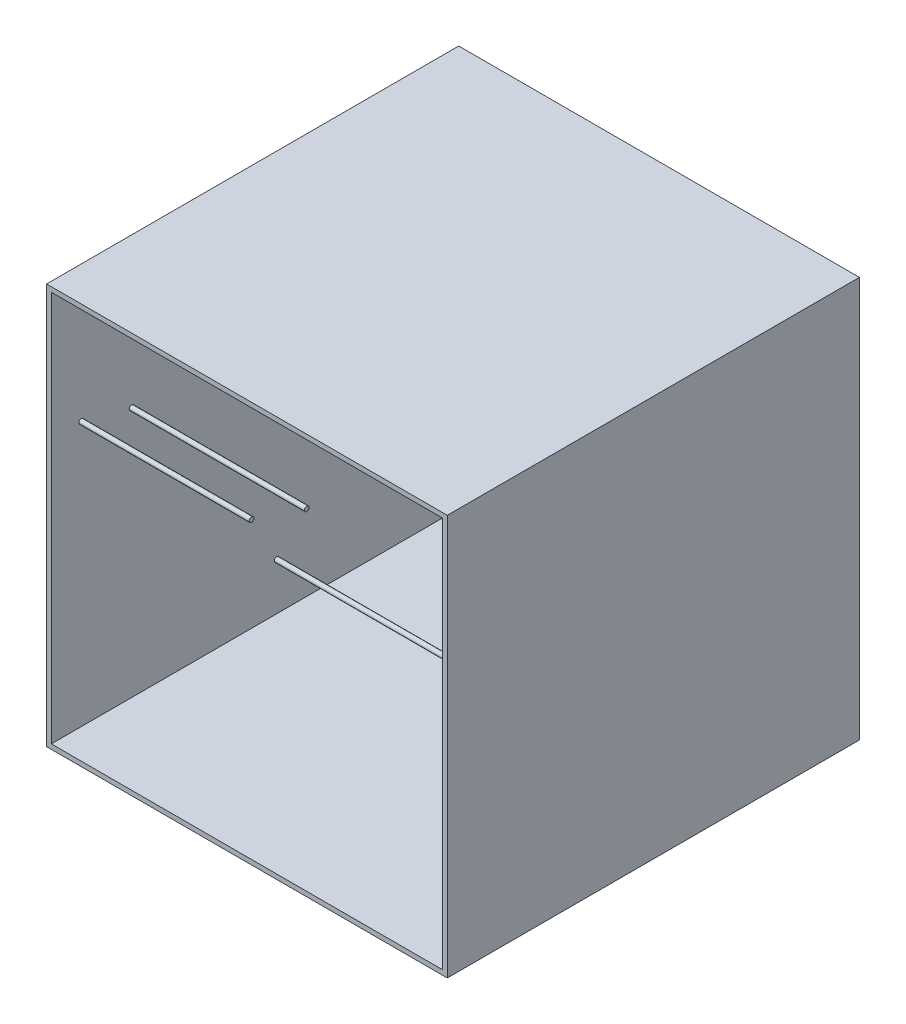
ISO-10303-21;
HEADER;
FILE_DESCRIPTION(('STEP AP214'),'2;1');
FILE_NAME('part.step','',(''),(''),'','','');
FILE_SCHEMA(('AUTOMOTIVE_DESIGN { 1 0 10303 214 1 1 1 1 }'));
ENDSEC;
DATA;
#1=APPLICATION_CONTEXT('core data for automotive mechanical design processes');
#2=APPLICATION_PROTOCOL_DEFINITION('international standard','automotive_design',2000,#1);
#3=PRODUCT_CONTEXT('',#1,'mechanical');
#4=PRODUCT('Part','Part','',(#3));
#5=PRODUCT_RELATED_PRODUCT_CATEGORY('part','',(#4));
#6=PRODUCT_DEFINITION_FORMATION('','',#4);
#7=PRODUCT_DEFINITION_CONTEXT('part definition',#1,'design');
#8=PRODUCT_DEFINITION('design','',#6,#7);
#9=PRODUCT_DEFINITION_SHAPE('','',#8);
#10=(LENGTH_UNIT() NAMED_UNIT(*) SI_UNIT(.MILLI.,.METRE.));
#11=(NAMED_UNIT(*) PLANE_ANGLE_UNIT() SI_UNIT($,.RADIAN.));
#12=(NAMED_UNIT(*) SI_UNIT($,.STERADIAN.) SOLID_ANGLE_UNIT());
#13=UNCERTAINTY_MEASURE_WITH_UNIT(LENGTH_MEASURE(1.E-05),#10,'distance_accuracy_value','');
#14=(GEOMETRIC_REPRESENTATION_CONTEXT(3) GLOBAL_UNCERTAINTY_ASSIGNED_CONTEXT((#13)) GLOBAL_UNIT_ASSIGNED_CONTEXT((#10,
#11,#12)) REPRESENTATION_CONTEXT('',''));
#15=CARTESIAN_POINT('',(0.,0.,0.));
#16=DIRECTION('',(0.,0.,1.));
#17=DIRECTION('',(1.,0.,0.));
#18=AXIS2_PLACEMENT_3D('',#15,#16,#17);
#19=CARTESIAN_POINT('',(0.,0.,432.));
#20=DIRECTION('',(0.,0.,1.));
#21=DIRECTION('',(1.,0.,0.));
#22=AXIS2_PLACEMENT_3D('',#19,#20,#21);
#23=PLANE('',#22);
#24=DIRECTION('',(0.,-1.,0.));
#25=VECTOR('',#24,1.);
#26=CARTESIAN_POINT('',(-210.,210.,432.));
#27=LINE('',#26,#25);
#28=CARTESIAN_POINT('',(-210.,210.,432.));
#29=VERTEX_POINT('',#28);
#30=CARTESIAN_POINT('',(-210.,-210.,432.));
#31=VERTEX_POINT('',#30);
#32=EDGE_CURVE('E161',#29,#31,#27,.T.);
#33=ORIENTED_EDGE('',*,*,#32,.T.);
#34=DIRECTION('',(1.,0.,0.));
#35=VECTOR('',#34,1.);
#36=CARTESIAN_POINT('',(-210.,-210.,432.));
#37=LINE('',#36,#35);
#38=CARTESIAN_POINT('',(210.,-210.,432.));
#39=VERTEX_POINT('',#38);
#40=EDGE_CURVE('E165',#31,#39,#37,.T.);
#41=ORIENTED_EDGE('',*,*,#40,.T.);
#42=DIRECTION('',(0.,1.,0.));
#43=VECTOR('',#42,1.);
#44=CARTESIAN_POINT('',(210.,210.,432.));
#45=LINE('',#44,#43);
#46=CARTESIAN_POINT('',(210.,210.,432.));
#47=VERTEX_POINT('',#46);
#48=EDGE_CURVE('E169',#39,#47,#45,.T.);
#49=ORIENTED_EDGE('',*,*,#48,.T.);
#50=DIRECTION('',(-1.,0.,0.));
#51=VECTOR('',#50,1.);
#52=CARTESIAN_POINT('',(-210.,210.,432.));
#53=LINE('',#52,#51);
#54=EDGE_CURVE('E172',#47,#29,#53,.T.);
#55=ORIENTED_EDGE('',*,*,#54,.T.);
#56=EDGE_LOOP('',(#33,#41,#49,#55));
#57=FACE_BOUND('',#56,.T.);
#58=DIRECTION('',(1.,0.,0.));
#59=VECTOR('',#58,1.);
#60=CARTESIAN_POINT('',(205.,-205.,432.));
#61=LINE('',#60,#59);
#62=CARTESIAN_POINT('',(-205.,-205.,432.));
#63=VERTEX_POINT('',#62);
#64=CARTESIAN_POINT('',(205.,-205.,432.));
#65=VERTEX_POINT('',#64);
#66=EDGE_CURVE('E120',#63,#65,#61,.T.);
#67=ORIENTED_EDGE('',*,*,#66,.F.);
#68=DIRECTION('',(0.,-1.,0.));
#69=VECTOR('',#68,1.);
#70=CARTESIAN_POINT('',(-205.,-205.,432.));
#71=LINE('',#70,#69);
#72=CARTESIAN_POINT('',(-205.,205.,432.));
#73=VERTEX_POINT('',#72);
#74=EDGE_CURVE('E111',#73,#63,#71,.T.);
#75=ORIENTED_EDGE('',*,*,#74,.F.);
#76=DIRECTION('',(-1.,0.,0.));
#77=VECTOR('',#76,1.);
#78=CARTESIAN_POINT('',(205.,205.,432.));
#79=LINE('',#78,#77);
#80=CARTESIAN_POINT('',(205.,205.,432.));
#81=VERTEX_POINT('',#80);
#82=EDGE_CURVE('E137',#81,#73,#79,.T.);
#83=ORIENTED_EDGE('',*,*,#82,.F.);
#84=DIRECTION('',(0.,1.,0.));
#85=VECTOR('',#84,1.);
#86=CARTESIAN_POINT('',(205.,-205.,432.));
#87=LINE('',#86,#85);
#88=EDGE_CURVE('E133',#65,#81,#87,.T.);
#89=ORIENTED_EDGE('',*,*,#88,.F.);
#90=EDGE_LOOP('',(#67,#75,#83,#89));
#91=FACE_BOUND('',#90,.T.);
#92=ADVANCED_FACE('F45',(#57,#91),#23,.T.);
#93=CARTESIAN_POINT('',(0.,0.,0.));
#94=DIRECTION('',(0.,0.,1.));
#95=DIRECTION('',(1.,0.,0.));
#96=AXIS2_PLACEMENT_3D('',#93,#94,#95);
#97=PLANE('',#96);
#98=DIRECTION('',(0.,-1.,0.));
#99=VECTOR('',#98,1.);
#100=CARTESIAN_POINT('',(-210.,210.,0.));
#101=LINE('',#100,#99);
#102=CARTESIAN_POINT('',(-210.,210.,0.));
#103=VERTEX_POINT('',#102);
#104=CARTESIAN_POINT('',(-210.,-210.,0.));
#105=VERTEX_POINT('',#104);
#106=EDGE_CURVE('E129',#103,#105,#101,.T.);
#107=ORIENTED_EDGE('',*,*,#106,.F.);
#108=DIRECTION('',(-1.,0.,0.));
#109=VECTOR('',#108,1.);
#110=CARTESIAN_POINT('',(-210.,210.,0.));
#111=LINE('',#110,#109);
#112=CARTESIAN_POINT('',(210.,210.,0.));
#113=VERTEX_POINT('',#112);
#114=EDGE_CURVE('E166',#113,#103,#111,.T.);
#115=ORIENTED_EDGE('',*,*,#114,.F.);
#116=DIRECTION('',(0.,1.,0.));
#117=VECTOR('',#116,1.);
#118=CARTESIAN_POINT('',(210.,210.,0.));
#119=LINE('',#118,#117);
#120=CARTESIAN_POINT('',(210.,-210.,0.));
#121=VERTEX_POINT('',#120);
#122=EDGE_CURVE('E182',#121,#113,#119,.T.);
#123=ORIENTED_EDGE('',*,*,#122,.F.);
#124=DIRECTION('',(1.,0.,0.));
#125=VECTOR('',#124,1.);
#126=CARTESIAN_POINT('',(-210.,-210.,0.));
#127=LINE('',#126,#125);
#128=EDGE_CURVE('E179',#105,#121,#127,.T.);
#129=ORIENTED_EDGE('',*,*,#128,.F.);
#130=EDGE_LOOP('',(#107,#115,#123,#129));
#131=FACE_BOUND('',#130,.T.);
#132=DIRECTION('',(0.,-1.,0.));
#133=VECTOR('',#132,1.);
#134=CARTESIAN_POINT('',(-205.,-205.,0.));
#135=LINE('',#134,#133);
#136=CARTESIAN_POINT('',(-205.,205.,0.));
#137=VERTEX_POINT('',#136);
#138=CARTESIAN_POINT('',(-205.,-205.,0.));
#139=VERTEX_POINT('',#138);
#140=EDGE_CURVE('E69',#137,#139,#135,.T.);
#141=ORIENTED_EDGE('',*,*,#140,.T.);
#142=DIRECTION('',(1.,0.,0.));
#143=VECTOR('',#142,1.);
#144=CARTESIAN_POINT('',(205.,-205.,0.));
#145=LINE('',#144,#143);
#146=CARTESIAN_POINT('',(205.,-205.,0.));
#147=VERTEX_POINT('',#146);
#148=EDGE_CURVE('E127',#139,#147,#145,.T.);
#149=ORIENTED_EDGE('',*,*,#148,.T.);
#150=DIRECTION('',(0.,1.,0.));
#151=VECTOR('',#150,1.);
#152=CARTESIAN_POINT('',(205.,-205.,0.));
#153=LINE('',#152,#151);
#154=CARTESIAN_POINT('',(205.,205.,0.));
#155=VERTEX_POINT('',#154);
#156=EDGE_CURVE('E148',#147,#155,#153,.T.);
#157=ORIENTED_EDGE('',*,*,#156,.T.);
#158=DIRECTION('',(-1.,0.,0.));
#159=VECTOR('',#158,1.);
#160=CARTESIAN_POINT('',(205.,205.,0.));
#161=LINE('',#160,#159);
#162=EDGE_CURVE('E121',#155,#137,#161,.T.);
#163=ORIENTED_EDGE('',*,*,#162,.T.);
#164=EDGE_LOOP('',(#141,#149,#157,#163));
#165=FACE_BOUND('',#164,.T.);
#166=ADVANCED_FACE('F229',(#131,#165),#97,.F.);
#167=CARTESIAN_POINT('',(-210.,210.,432.));
#168=DIRECTION('',(1.,0.,0.));
#169=DIRECTION('',(0.,0.,-1.));
#170=AXIS2_PLACEMENT_3D('',#167,#168,#169);
#171=PLANE('',#170);
#172=ORIENTED_EDGE('',*,*,#106,.T.);
#173=DIRECTION('',(0.,0.,-1.));
#174=VECTOR('',#173,1.);
#175=CARTESIAN_POINT('',(-210.,-210.,432.));
#176=LINE('',#175,#174);
#177=EDGE_CURVE('E198',#31,#105,#176,.T.);
#178=ORIENTED_EDGE('',*,*,#177,.F.);
#179=ORIENTED_EDGE('',*,*,#32,.F.);
#180=DIRECTION('',(0.,0.,-1.));
#181=VECTOR('',#180,1.);
#182=CARTESIAN_POINT('',(-210.,210.,432.));
#183=LINE('',#182,#181);
#184=EDGE_CURVE('E175',#29,#103,#183,.T.);
#185=ORIENTED_EDGE('',*,*,#184,.T.);
#186=EDGE_LOOP('',(#172,#178,#179,#185));
#187=FACE_BOUND('',#186,.T.);
#188=ADVANCED_FACE('F47',(#187),#171,.F.);
#189=CARTESIAN_POINT('',(-210.,-210.,432.));
#190=DIRECTION('',(0.,1.,0.));
#191=DIRECTION('',(-1.,0.,0.));
#192=AXIS2_PLACEMENT_3D('',#189,#190,#191);
#193=PLANE('',#192);
#194=ORIENTED_EDGE('',*,*,#128,.T.);
#195=DIRECTION('',(0.,0.,-1.));
#196=VECTOR('',#195,1.);
#197=CARTESIAN_POINT('',(210.,-210.,432.));
#198=LINE('',#197,#196);
#199=EDGE_CURVE('E194',#39,#121,#198,.T.);
#200=ORIENTED_EDGE('',*,*,#199,.F.);
#201=ORIENTED_EDGE('',*,*,#40,.F.);
#202=ORIENTED_EDGE('',*,*,#177,.T.);
#203=EDGE_LOOP('',(#194,#200,#201,#202));
#204=FACE_BOUND('',#203,.T.);
#205=ADVANCED_FACE('F256',(#204),#193,.F.);
#206=CARTESIAN_POINT('',(210.,210.,432.));
#207=DIRECTION('',(-1.,0.,0.));
#208=DIRECTION('',(0.,0.,1.));
#209=AXIS2_PLACEMENT_3D('',#206,#207,#208);
#210=PLANE('',#209);
#211=ORIENTED_EDGE('',*,*,#122,.T.);
#212=DIRECTION('',(0.,0.,-1.));
#213=VECTOR('',#212,1.);
#214=CARTESIAN_POINT('',(210.,210.,432.));
#215=LINE('',#214,#213);
#216=EDGE_CURVE('E190',#47,#113,#215,.T.);
#217=ORIENTED_EDGE('',*,*,#216,.F.);
#218=ORIENTED_EDGE('',*,*,#48,.F.);
#219=ORIENTED_EDGE('',*,*,#199,.T.);
#220=EDGE_LOOP('',(#211,#217,#218,#219));
#221=FACE_BOUND('',#220,.T.);
#222=ADVANCED_FACE('F253',(#221),#210,.F.);
#223=CARTESIAN_POINT('',(-210.,210.,432.));
#224=DIRECTION('',(0.,-1.,0.));
#225=DIRECTION('',(1.,0.,0.));
#226=AXIS2_PLACEMENT_3D('',#223,#224,#225);
#227=PLANE('',#226);
#228=ORIENTED_EDGE('',*,*,#114,.T.);
#229=ORIENTED_EDGE('',*,*,#184,.F.);
#230=ORIENTED_EDGE('',*,*,#54,.F.);
#231=ORIENTED_EDGE('',*,*,#216,.T.);
#232=EDGE_LOOP('',(#228,#229,#230,#231));
#233=FACE_BOUND('',#232,.T.);
#234=ADVANCED_FACE('F250',(#233),#227,.F.);
#235=CARTESIAN_POINT('',(-205.,-205.,432.));
#236=DIRECTION('',(1.,0.,0.));
#237=DIRECTION('',(0.,0.,-1.));
#238=AXIS2_PLACEMENT_3D('',#235,#236,#237);
#239=PLANE('',#238);
#240=CARTESIAN_POINT('',(-205.,-10.05,150.03));
#241=DIRECTION('',(1.,0.,0.));
#242=DIRECTION('',(0.,0.,-1.));
#243=AXIS2_PLACEMENT_3D('',#240,#241,#242);
#244=CIRCLE('',#243,15.);
#245=CARTESIAN_POINT('',(-205.,-10.05,135.03));
#246=VERTEX_POINT('',#245);
#247=EDGE_CURVE('E11',#246,#246,#244,.T.);
#248=ORIENTED_EDGE('',*,*,#247,.F.);
#249=EDGE_LOOP('',(#248));
#250=FACE_BOUND('',#249,.T.);
#251=CARTESIAN_POINT('',(-205.,58.16,347.87));
#252=DIRECTION('',(1.,0.,0.));
#253=DIRECTION('',(0.,0.,-1.));
#254=AXIS2_PLACEMENT_3D('',#251,#252,#253);
#255=CIRCLE('',#254,2.50000000000002);
#256=CARTESIAN_POINT('',(-205.,58.16,345.37));
#257=VERTEX_POINT('',#256);
#258=EDGE_CURVE('E206',#257,#257,#255,.T.);
#259=ORIENTED_EDGE('',*,*,#258,.F.);
#260=EDGE_LOOP('',(#259));
#261=FACE_BOUND('',#260,.T.);
#262=CARTESIAN_POINT('',(-205.,72.17,400.68));
#263=DIRECTION('',(1.,0.,0.));
#264=DIRECTION('',(0.,0.,-1.));
#265=AXIS2_PLACEMENT_3D('',#262,#263,#264);
#266=CIRCLE('',#265,2.50000000000002);
#267=CARTESIAN_POINT('',(-205.,72.17,398.18));
#268=VERTEX_POINT('',#267);
#269=EDGE_CURVE('E202',#268,#268,#266,.T.);
#270=ORIENTED_EDGE('',*,*,#269,.F.);
#271=EDGE_LOOP('',(#270));
#272=FACE_BOUND('',#271,.T.);
#273=ORIENTED_EDGE('',*,*,#140,.F.);
#274=DIRECTION('',(0.,0.,-1.));
#275=VECTOR('',#274,1.);
#276=CARTESIAN_POINT('',(-205.,205.,432.));
#277=LINE('',#276,#275);
#278=EDGE_CURVE('E115',#73,#137,#277,.T.);
#279=ORIENTED_EDGE('',*,*,#278,.F.);
#280=ORIENTED_EDGE('',*,*,#74,.T.);
#281=DIRECTION('',(0.,0.,-1.));
#282=VECTOR('',#281,1.);
#283=CARTESIAN_POINT('',(-205.,-205.,432.));
#284=LINE('',#283,#282);
#285=EDGE_CURVE('E114',#63,#139,#284,.T.);
#286=ORIENTED_EDGE('',*,*,#285,.T.);
#287=EDGE_LOOP('',(#273,#279,#280,#286));
#288=FACE_BOUND('',#287,.T.);
#289=ADVANCED_FACE('F113',(#250,#261,#272,#288),#239,.T.);
#290=CARTESIAN_POINT('',(205.,-205.,432.));
#291=DIRECTION('',(0.,1.,0.));
#292=DIRECTION('',(-1.,0.,0.));
#293=AXIS2_PLACEMENT_3D('',#290,#291,#292);
#294=PLANE('',#293);
#295=ORIENTED_EDGE('',*,*,#148,.F.);
#296=ORIENTED_EDGE('',*,*,#285,.F.);
#297=ORIENTED_EDGE('',*,*,#66,.T.);
#298=DIRECTION('',(0.,0.,-1.));
#299=VECTOR('',#298,1.);
#300=CARTESIAN_POINT('',(205.,-205.,432.));
#301=LINE('',#300,#299);
#302=EDGE_CURVE('E130',#65,#147,#301,.T.);
#303=ORIENTED_EDGE('',*,*,#302,.T.);
#304=EDGE_LOOP('',(#295,#296,#297,#303));
#305=FACE_BOUND('',#304,.T.);
#306=ADVANCED_FACE('F124',(#305),#294,.T.);
#307=CARTESIAN_POINT('',(205.,-205.,432.));
#308=DIRECTION('',(-1.,0.,0.));
#309=DIRECTION('',(0.,0.,1.));
#310=AXIS2_PLACEMENT_3D('',#307,#308,#309);
#311=PLANE('',#310);
#312=CARTESIAN_POINT('',(205.,75.92,427.35));
#313=DIRECTION('',(-1.,0.,0.));
#314=DIRECTION('',(0.,0.,1.));
#315=AXIS2_PLACEMENT_3D('',#312,#313,#314);
#316=CIRCLE('',#315,2.50000000000002);
#317=CARTESIAN_POINT('',(205.,75.92,429.85));
#318=VERTEX_POINT('',#317);
#319=EDGE_CURVE('E54',#318,#318,#316,.T.);
#320=ORIENTED_EDGE('',*,*,#319,.F.);
#321=EDGE_LOOP('',(#320));
#322=FACE_BOUND('',#321,.T.);
#323=CARTESIAN_POINT('',(205.,138.09,353.49));
#324=DIRECTION('',(-1.,0.,0.));
#325=DIRECTION('',(0.,0.,1.));
#326=AXIS2_PLACEMENT_3D('',#323,#324,#325);
#327=CIRCLE('',#326,2.50000000000002);
#328=CARTESIAN_POINT('',(205.,138.09,355.99));
#329=VERTEX_POINT('',#328);
#330=EDGE_CURVE('E210',#329,#329,#327,.T.);
#331=ORIENTED_EDGE('',*,*,#330,.F.);
#332=EDGE_LOOP('',(#331));
#333=FACE_BOUND('',#332,.T.);
#334=ORIENTED_EDGE('',*,*,#156,.F.);
#335=ORIENTED_EDGE('',*,*,#302,.F.);
#336=ORIENTED_EDGE('',*,*,#88,.T.);
#337=DIRECTION('',(0.,0.,-1.));
#338=VECTOR('',#337,1.);
#339=CARTESIAN_POINT('',(205.,205.,432.));
#340=LINE('',#339,#338);
#341=EDGE_CURVE('E61',#81,#155,#340,.T.);
#342=ORIENTED_EDGE('',*,*,#341,.T.);
#343=EDGE_LOOP('',(#334,#335,#336,#342));
#344=FACE_BOUND('',#343,.T.);
#345=ADVANCED_FACE('F220',(#322,#333,#344),#311,.T.);
#346=CARTESIAN_POINT('',(205.,205.,432.));
#347=DIRECTION('',(0.,-1.,0.));
#348=DIRECTION('',(1.,0.,0.));
#349=AXIS2_PLACEMENT_3D('',#346,#347,#348);
#350=PLANE('',#349);
#351=ORIENTED_EDGE('',*,*,#162,.F.);
#352=ORIENTED_EDGE('',*,*,#341,.F.);
#353=ORIENTED_EDGE('',*,*,#82,.T.);
#354=ORIENTED_EDGE('',*,*,#278,.T.);
#355=EDGE_LOOP('',(#351,#352,#353,#354));
#356=FACE_BOUND('',#355,.T.);
#357=ADVANCED_FACE('F223',(#356),#350,.T.);
#358=CARTESIAN_POINT('',(-26.4499999999999,72.17,400.68));
#359=DIRECTION('',(-1.,0.,0.));
#360=DIRECTION('',(0.,0.,1.));
#361=AXIS2_PLACEMENT_3D('',#358,#359,#360);
#362=CYLINDRICAL_SURFACE('',#361,2.50000000000002);
#363=ORIENTED_EDGE('',*,*,#269,.T.);
#364=EDGE_LOOP('',(#363));
#365=FACE_BOUND('',#364,.T.);
#366=CARTESIAN_POINT('',(-26.4499999999999,72.17,400.68));
#367=DIRECTION('',(-1.,0.,0.));
#368=DIRECTION('',(0.,0.,1.));
#369=AXIS2_PLACEMENT_3D('',#366,#367,#368);
#370=CIRCLE('',#369,2.50000000000002);
#371=CARTESIAN_POINT('',(-26.4499999999999,72.17,403.18));
#372=VERTEX_POINT('',#371);
#373=EDGE_CURVE('E145',#372,#372,#370,.T.);
#374=ORIENTED_EDGE('',*,*,#373,.T.);
#375=EDGE_LOOP('',(#374));
#376=FACE_BOUND('',#375,.T.);
#377=ADVANCED_FACE('F231',(#365,#376),#362,.T.);
#378=CARTESIAN_POINT('',(-26.4499999999999,0.,0.));
#379=DIRECTION('',(-1.,0.,0.));
#380=DIRECTION('',(0.,0.,1.));
#381=AXIS2_PLACEMENT_3D('',#378,#379,#380);
#382=PLANE('',#381);
#383=ORIENTED_EDGE('',*,*,#373,.F.);
#384=EDGE_LOOP('',(#383));
#385=FACE_BOUND('',#384,.T.);
#386=ADVANCED_FACE('F236',(#385),#382,.F.);
#387=CARTESIAN_POINT('',(-21.4499999999999,58.16,347.87));
#388=DIRECTION('',(-1.,0.,0.));
#389=DIRECTION('',(0.,0.,1.));
#390=AXIS2_PLACEMENT_3D('',#387,#388,#389);
#391=CYLINDRICAL_SURFACE('',#390,2.50000000000002);
#392=ORIENTED_EDGE('',*,*,#258,.T.);
#393=EDGE_LOOP('',(#392));
#394=FACE_BOUND('',#393,.T.);
#395=CARTESIAN_POINT('',(-21.4499999999999,58.16,347.87));
#396=DIRECTION('',(-1.,0.,0.));
#397=DIRECTION('',(0.,0.,1.));
#398=AXIS2_PLACEMENT_3D('',#395,#396,#397);
#399=CIRCLE('',#398,2.50000000000002);
#400=CARTESIAN_POINT('',(-21.4499999999999,58.16,350.37));
#401=VERTEX_POINT('',#400);
#402=EDGE_CURVE('E473',#401,#401,#399,.T.);
#403=ORIENTED_EDGE('',*,*,#402,.T.);
#404=EDGE_LOOP('',(#403));
#405=FACE_BOUND('',#404,.T.);
#406=ADVANCED_FACE('F330',(#394,#405),#391,.T.);
#407=CARTESIAN_POINT('',(-21.4499999999999,58.16,347.87));
#408=DIRECTION('',(-1.,0.,0.));
#409=DIRECTION('',(0.,0.,1.));
#410=AXIS2_PLACEMENT_3D('',#407,#408,#409);
#411=PLANE('',#410);
#412=ORIENTED_EDGE('',*,*,#402,.F.);
#413=EDGE_LOOP('',(#412));
#414=FACE_BOUND('',#413,.T.);
#415=ADVANCED_FACE('F341',(#414),#411,.F.);
#416=CARTESIAN_POINT('',(26.55,138.09,353.49));
#417=DIRECTION('',(1.,0.,0.));
#418=DIRECTION('',(0.,0.,-1.));
#419=AXIS2_PLACEMENT_3D('',#416,#417,#418);
#420=CYLINDRICAL_SURFACE('',#419,2.50000000000002);
#421=ORIENTED_EDGE('',*,*,#330,.T.);
#422=EDGE_LOOP('',(#421));
#423=FACE_BOUND('',#422,.T.);
#424=CARTESIAN_POINT('',(26.55,138.09,353.49));
#425=DIRECTION('',(1.,0.,0.));
#426=DIRECTION('',(0.,0.,-1.));
#427=AXIS2_PLACEMENT_3D('',#424,#425,#426);
#428=CIRCLE('',#427,2.50000000000002);
#429=CARTESIAN_POINT('',(26.55,138.09,350.99));
#430=VERTEX_POINT('',#429);
#431=EDGE_CURVE('E476',#430,#430,#428,.T.);
#432=ORIENTED_EDGE('',*,*,#431,.T.);
#433=EDGE_LOOP('',(#432));
#434=FACE_BOUND('',#433,.T.);
#435=ADVANCED_FACE('F352',(#423,#434),#420,.T.);
#436=CARTESIAN_POINT('',(26.55,138.09,353.49));
#437=DIRECTION('',(1.,0.,0.));
#438=DIRECTION('',(0.,0.,-1.));
#439=AXIS2_PLACEMENT_3D('',#436,#437,#438);
#440=PLANE('',#439);
#441=ORIENTED_EDGE('',*,*,#431,.F.);
#442=EDGE_LOOP('',(#441));
#443=FACE_BOUND('',#442,.T.);
#444=ADVANCED_FACE('F375',(#443),#440,.F.);
#445=CARTESIAN_POINT('',(26.55,75.92,427.35));
#446=DIRECTION('',(1.,0.,0.));
#447=DIRECTION('',(0.,0.,-1.));
#448=AXIS2_PLACEMENT_3D('',#445,#446,#447);
#449=CYLINDRICAL_SURFACE('',#448,2.50000000000002);
#450=ORIENTED_EDGE('',*,*,#319,.T.);
#451=EDGE_LOOP('',(#450));
#452=FACE_BOUND('',#451,.T.);
#453=CARTESIAN_POINT('',(26.55,75.92,427.35));
#454=DIRECTION('',(1.,0.,0.));
#455=DIRECTION('',(0.,0.,-1.));
#456=AXIS2_PLACEMENT_3D('',#453,#454,#455);
#457=CIRCLE('',#456,2.50000000000002);
#458=CARTESIAN_POINT('',(26.55,75.92,424.85));
#459=VERTEX_POINT('',#458);
#460=EDGE_CURVE('E482',#459,#459,#457,.T.);
#461=ORIENTED_EDGE('',*,*,#460,.T.);
#462=EDGE_LOOP('',(#461));
#463=FACE_BOUND('',#462,.T.);
#464=ADVANCED_FACE('F217',(#452,#463),#449,.T.);
#465=CARTESIAN_POINT('',(26.55,75.92,427.35));
#466=DIRECTION('',(1.,0.,0.));
#467=DIRECTION('',(0.,0.,-1.));
#468=AXIS2_PLACEMENT_3D('',#465,#466,#467);
#469=PLANE('',#468);
#470=ORIENTED_EDGE('',*,*,#460,.F.);
#471=EDGE_LOOP('',(#470));
#472=FACE_BOUND('',#471,.T.);
#473=ADVANCED_FACE('F395',(#472),#469,.F.);
#474=CARTESIAN_POINT('',(-26.55,-10.05,150.03));
#475=DIRECTION('',(-1.,0.,0.));
#476=DIRECTION('',(0.,0.,1.));
#477=AXIS2_PLACEMENT_3D('',#474,#475,#476);
#478=CYLINDRICAL_SURFACE('',#477,15.);
#479=ORIENTED_EDGE('',*,*,#247,.T.);
#480=EDGE_LOOP('',(#479));
#481=FACE_BOUND('',#480,.T.);
#482=CARTESIAN_POINT('',(-26.55,-10.05,150.03));
#483=DIRECTION('',(-1.,0.,0.));
#484=DIRECTION('',(0.,0.,1.));
#485=AXIS2_PLACEMENT_3D('',#482,#483,#484);
#486=CIRCLE('',#485,15.);
#487=CARTESIAN_POINT('',(-26.55,-10.05,165.03));
#488=VERTEX_POINT('',#487);
#489=EDGE_CURVE('E486',#488,#488,#486,.T.);
#490=ORIENTED_EDGE('',*,*,#489,.T.);
#491=EDGE_LOOP('',(#490));
#492=FACE_BOUND('',#491,.T.);
#493=ADVANCED_FACE('F404',(#481,#492),#478,.T.);
#494=CARTESIAN_POINT('',(-26.55,-10.05,150.03));
#495=DIRECTION('',(-1.,0.,0.));
#496=DIRECTION('',(0.,0.,1.));
#497=AXIS2_PLACEMENT_3D('',#494,#495,#496);
#498=PLANE('',#497);
#499=ORIENTED_EDGE('',*,*,#489,.F.);
#500=EDGE_LOOP('',(#499));
#501=FACE_BOUND('',#500,.T.);
#502=ADVANCED_FACE('F416',(#501),#498,.F.);
#503=CLOSED_SHELL('',(#92,#166,#188,#205,#222,#234,#289,#306,#345,#357,#377,#386,#406,#415,#435,
#444,#464,#473,#493,#502));
#504=MANIFOLD_SOLID_BREP('B2',#503);
#505=ADVANCED_BREP_SHAPE_REPRESENTATION('',(#18,#504),#14);
#506=SHAPE_DEFINITION_REPRESENTATION(#9,#505);
ENDSEC;
END-ISO-10303-21;
